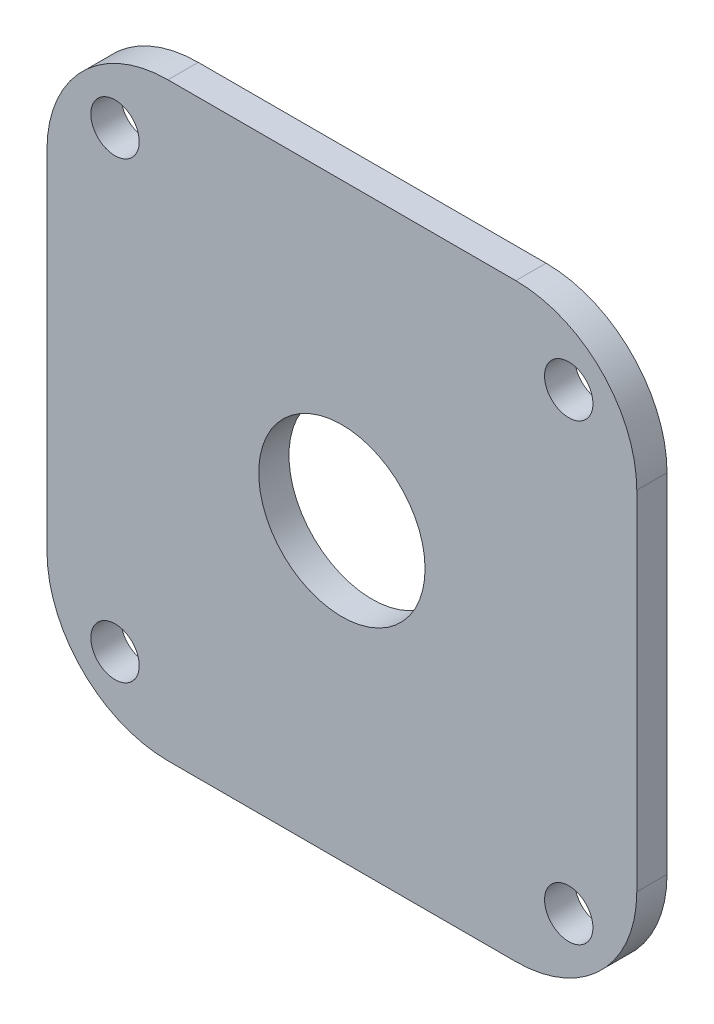
ISO-10303-21;
HEADER;
FILE_DESCRIPTION(('STEP AP214'),'2;1');
FILE_NAME('part.step','',(''),(''),'','','');
FILE_SCHEMA(('AUTOMOTIVE_DESIGN { 1 0 10303 214 1 1 1 1 }'));
ENDSEC;
DATA;
#1=APPLICATION_CONTEXT('core data for automotive mechanical design processes');
#2=APPLICATION_PROTOCOL_DEFINITION('international standard','automotive_design',2000,#1);
#3=PRODUCT_CONTEXT('',#1,'mechanical');
#4=PRODUCT('Part','Part','',(#3));
#5=PRODUCT_RELATED_PRODUCT_CATEGORY('part','',(#4));
#6=PRODUCT_DEFINITION_FORMATION('','',#4);
#7=PRODUCT_DEFINITION_CONTEXT('part definition',#1,'design');
#8=PRODUCT_DEFINITION('design','',#6,#7);
#9=PRODUCT_DEFINITION_SHAPE('','',#8);
#10=(LENGTH_UNIT() NAMED_UNIT(*) SI_UNIT(.MILLI.,.METRE.));
#11=(NAMED_UNIT(*) PLANE_ANGLE_UNIT() SI_UNIT($,.RADIAN.));
#12=(NAMED_UNIT(*) SI_UNIT($,.STERADIAN.) SOLID_ANGLE_UNIT());
#13=UNCERTAINTY_MEASURE_WITH_UNIT(LENGTH_MEASURE(1.E-05),#10,'distance_accuracy_value','');
#14=(GEOMETRIC_REPRESENTATION_CONTEXT(3) GLOBAL_UNCERTAINTY_ASSIGNED_CONTEXT((#13)) GLOBAL_UNIT_ASSIGNED_CONTEXT((#10,
#11,#12)) REPRESENTATION_CONTEXT('',''));
#15=CARTESIAN_POINT('',(0.,0.,0.));
#16=DIRECTION('',(0.,0.,1.));
#17=DIRECTION('',(1.,0.,0.));
#18=AXIS2_PLACEMENT_3D('',#15,#16,#17);
#19=CARTESIAN_POINT('',(11.5,-11.5,2.));
#20=DIRECTION('',(0.,0.,1.));
#21=DIRECTION('',(1.,0.,0.));
#22=AXIS2_PLACEMENT_3D('',#19,#20,#21);
#23=CYLINDRICAL_SURFACE('',#22,8.);
#24=DIRECTION('',(0.,0.,1.));
#25=VECTOR('',#24,1.);
#26=CARTESIAN_POINT('',(11.5,-19.5,2.));
#27=LINE('',#26,#25);
#28=CARTESIAN_POINT('',(11.5,-19.5,0.));
#29=VERTEX_POINT('',#28);
#30=CARTESIAN_POINT('',(11.5,-19.5,2.));
#31=VERTEX_POINT('',#30);
#32=EDGE_CURVE('E193',#29,#31,#27,.T.);
#33=ORIENTED_EDGE('',*,*,#32,.F.);
#34=CARTESIAN_POINT('',(11.5,-11.5,0.));
#35=DIRECTION('',(0.,0.,1.));
#36=DIRECTION('',(1.,0.,0.));
#37=AXIS2_PLACEMENT_3D('',#34,#35,#36);
#38=CIRCLE('',#37,8.);
#39=CARTESIAN_POINT('',(19.5,-11.5,0.));
#40=VERTEX_POINT('',#39);
#41=EDGE_CURVE('E55',#40,#29,#38,.F.);
#42=ORIENTED_EDGE('',*,*,#41,.F.);
#43=DIRECTION('',(0.,0.,1.));
#44=VECTOR('',#43,1.);
#45=CARTESIAN_POINT('',(19.5,-11.5,2.));
#46=LINE('',#45,#44);
#47=CARTESIAN_POINT('',(19.5,-11.5,2.));
#48=VERTEX_POINT('',#47);
#49=EDGE_CURVE('E197',#48,#40,#46,.F.);
#50=ORIENTED_EDGE('',*,*,#49,.F.);
#51=CARTESIAN_POINT('',(11.5,-11.5,2.));
#52=DIRECTION('',(0.,0.,1.));
#53=DIRECTION('',(1.,0.,0.));
#54=AXIS2_PLACEMENT_3D('',#51,#52,#53);
#55=CIRCLE('',#54,8.);
#56=EDGE_CURVE('E11',#31,#48,#55,.T.);
#57=ORIENTED_EDGE('',*,*,#56,.F.);
#58=EDGE_LOOP('',(#33,#42,#50,#57));
#59=FACE_BOUND('',#58,.T.);
#60=ADVANCED_FACE('F47',(#59),#23,.T.);
#61=CARTESIAN_POINT('',(-11.5,-11.5,2.));
#62=DIRECTION('',(0.,0.,1.));
#63=DIRECTION('',(1.,0.,0.));
#64=AXIS2_PLACEMENT_3D('',#61,#62,#63);
#65=CYLINDRICAL_SURFACE('',#64,8.);
#66=DIRECTION('',(0.,0.,-1.));
#67=VECTOR('',#66,1.);
#68=CARTESIAN_POINT('',(-11.5,-19.5,2.));
#69=LINE('',#68,#67);
#70=CARTESIAN_POINT('',(-11.5,-19.5,2.));
#71=VERTEX_POINT('',#70);
#72=CARTESIAN_POINT('',(-11.5,-19.5,0.));
#73=VERTEX_POINT('',#72);
#74=EDGE_CURVE('E179',#71,#73,#69,.T.);
#75=ORIENTED_EDGE('',*,*,#74,.F.);
#76=CARTESIAN_POINT('',(-11.5,-11.5,2.));
#77=DIRECTION('',(0.,0.,1.));
#78=DIRECTION('',(1.,0.,0.));
#79=AXIS2_PLACEMENT_3D('',#76,#77,#78);
#80=CIRCLE('',#79,8.);
#81=CARTESIAN_POINT('',(-19.5,-11.5,2.));
#82=VERTEX_POINT('',#81);
#83=EDGE_CURVE('E187',#82,#71,#80,.T.);
#84=ORIENTED_EDGE('',*,*,#83,.F.);
#85=DIRECTION('',(0.,0.,-1.));
#86=VECTOR('',#85,1.);
#87=CARTESIAN_POINT('',(-19.5,-11.5,2.));
#88=LINE('',#87,#86);
#89=CARTESIAN_POINT('',(-19.5,-11.5,0.));
#90=VERTEX_POINT('',#89);
#91=EDGE_CURVE('E183',#90,#82,#88,.F.);
#92=ORIENTED_EDGE('',*,*,#91,.F.);
#93=CARTESIAN_POINT('',(-11.5,-11.5,0.));
#94=DIRECTION('',(0.,0.,1.));
#95=DIRECTION('',(1.,0.,0.));
#96=AXIS2_PLACEMENT_3D('',#93,#94,#95);
#97=CIRCLE('',#96,8.);
#98=EDGE_CURVE('E190',#73,#90,#97,.F.);
#99=ORIENTED_EDGE('',*,*,#98,.F.);
#100=EDGE_LOOP('',(#75,#84,#92,#99));
#101=FACE_BOUND('',#100,.T.);
#102=ADVANCED_FACE('F207',(#101),#65,.T.);
#103=CARTESIAN_POINT('',(11.5,11.5,2.));
#104=DIRECTION('',(0.,0.,-1.));
#105=DIRECTION('',(-1.,0.,0.));
#106=AXIS2_PLACEMENT_3D('',#103,#104,#105);
#107=CYLINDRICAL_SURFACE('',#106,8.);
#108=DIRECTION('',(0.,0.,1.));
#109=VECTOR('',#108,1.);
#110=CARTESIAN_POINT('',(19.5,11.5,2.));
#111=LINE('',#110,#109);
#112=CARTESIAN_POINT('',(19.5,11.5,0.));
#113=VERTEX_POINT('',#112);
#114=CARTESIAN_POINT('',(19.5,11.5,2.));
#115=VERTEX_POINT('',#114);
#116=EDGE_CURVE('E167',#113,#115,#111,.T.);
#117=ORIENTED_EDGE('',*,*,#116,.F.);
#118=CARTESIAN_POINT('',(11.5,11.5,0.));
#119=DIRECTION('',(0.,0.,1.));
#120=DIRECTION('',(1.,0.,0.));
#121=AXIS2_PLACEMENT_3D('',#118,#119,#120);
#122=CIRCLE('',#121,8.);
#123=CARTESIAN_POINT('',(11.5,19.5,0.));
#124=VERTEX_POINT('',#123);
#125=EDGE_CURVE('E173',#124,#113,#122,.F.);
#126=ORIENTED_EDGE('',*,*,#125,.F.);
#127=DIRECTION('',(0.,0.,1.));
#128=VECTOR('',#127,1.);
#129=CARTESIAN_POINT('',(11.5,19.5,2.));
#130=LINE('',#129,#128);
#131=CARTESIAN_POINT('',(11.5,19.5,2.));
#132=VERTEX_POINT('',#131);
#133=EDGE_CURVE('E139',#132,#124,#130,.F.);
#134=ORIENTED_EDGE('',*,*,#133,.F.);
#135=CARTESIAN_POINT('',(11.5,11.5,2.));
#136=DIRECTION('',(0.,0.,1.));
#137=DIRECTION('',(1.,0.,0.));
#138=AXIS2_PLACEMENT_3D('',#135,#136,#137);
#139=CIRCLE('',#138,8.);
#140=EDGE_CURVE('E176',#115,#132,#139,.T.);
#141=ORIENTED_EDGE('',*,*,#140,.F.);
#142=EDGE_LOOP('',(#117,#126,#134,#141));
#143=FACE_BOUND('',#142,.T.);
#144=ADVANCED_FACE('F272',(#143),#107,.T.);
#145=CARTESIAN_POINT('',(-11.5,11.5,2.));
#146=DIRECTION('',(0.,0.,1.));
#147=DIRECTION('',(1.,0.,0.));
#148=AXIS2_PLACEMENT_3D('',#145,#146,#147);
#149=CYLINDRICAL_SURFACE('',#148,8.);
#150=DIRECTION('',(0.,0.,1.));
#151=VECTOR('',#150,1.);
#152=CARTESIAN_POINT('',(-11.5,19.5,2.));
#153=LINE('',#152,#151);
#154=CARTESIAN_POINT('',(-11.5,19.5,0.));
#155=VERTEX_POINT('',#154);
#156=CARTESIAN_POINT('',(-11.5,19.5,2.));
#157=VERTEX_POINT('',#156);
#158=EDGE_CURVE('E127',#155,#157,#153,.T.);
#159=ORIENTED_EDGE('',*,*,#158,.F.);
#160=CARTESIAN_POINT('',(-11.5,11.5,0.));
#161=DIRECTION('',(0.,0.,1.));
#162=DIRECTION('',(1.,0.,0.));
#163=AXIS2_PLACEMENT_3D('',#160,#161,#162);
#164=CIRCLE('',#163,8.);
#165=CARTESIAN_POINT('',(-19.5,11.5,0.));
#166=VERTEX_POINT('',#165);
#167=EDGE_CURVE('E109',#166,#155,#164,.F.);
#168=ORIENTED_EDGE('',*,*,#167,.F.);
#169=DIRECTION('',(0.,0.,1.));
#170=VECTOR('',#169,1.);
#171=CARTESIAN_POINT('',(-19.5,11.5,2.));
#172=LINE('',#171,#170);
#173=CARTESIAN_POINT('',(-19.5,11.5,2.));
#174=VERTEX_POINT('',#173);
#175=EDGE_CURVE('E124',#174,#166,#172,.F.);
#176=ORIENTED_EDGE('',*,*,#175,.F.);
#177=CARTESIAN_POINT('',(-11.5,11.5,2.));
#178=DIRECTION('',(0.,0.,1.));
#179=DIRECTION('',(1.,0.,0.));
#180=AXIS2_PLACEMENT_3D('',#177,#178,#179);
#181=CIRCLE('',#180,8.);
#182=EDGE_CURVE('E123',#157,#174,#181,.T.);
#183=ORIENTED_EDGE('',*,*,#182,.F.);
#184=EDGE_LOOP('',(#159,#168,#176,#183));
#185=FACE_BOUND('',#184,.T.);
#186=ADVANCED_FACE('F128',(#185),#149,.T.);
#187=CARTESIAN_POINT('',(0.,19.5,2.));
#188=DIRECTION('',(0.,1.,0.));
#189=DIRECTION('',(0.,0.,1.));
#190=AXIS2_PLACEMENT_3D('',#187,#188,#189);
#191=PLANE('',#190);
#192=DIRECTION('',(1.,0.,0.));
#193=VECTOR('',#192,1.);
#194=CARTESIAN_POINT('',(0.,19.5,2.));
#195=LINE('',#194,#193);
#196=EDGE_CURVE('E214',#157,#132,#195,.T.);
#197=ORIENTED_EDGE('',*,*,#196,.T.);
#198=ORIENTED_EDGE('',*,*,#133,.T.);
#199=DIRECTION('',(1.,0.,0.));
#200=VECTOR('',#199,1.);
#201=CARTESIAN_POINT('',(0.,19.5,0.));
#202=LINE('',#201,#200);
#203=EDGE_CURVE('E116',#155,#124,#202,.T.);
#204=ORIENTED_EDGE('',*,*,#203,.F.);
#205=ORIENTED_EDGE('',*,*,#158,.T.);
#206=EDGE_LOOP('',(#197,#198,#204,#205));
#207=FACE_BOUND('',#206,.T.);
#208=ADVANCED_FACE('F137',(#207),#191,.T.);
#209=CARTESIAN_POINT('',(-19.5,0.,2.));
#210=DIRECTION('',(-1.,0.,0.));
#211=DIRECTION('',(0.,0.,1.));
#212=AXIS2_PLACEMENT_3D('',#209,#210,#211);
#213=PLANE('',#212);
#214=DIRECTION('',(0.,1.,0.));
#215=VECTOR('',#214,1.);
#216=CARTESIAN_POINT('',(-19.5,0.,0.));
#217=LINE('',#216,#215);
#218=EDGE_CURVE('E118',#90,#166,#217,.T.);
#219=ORIENTED_EDGE('',*,*,#218,.F.);
#220=ORIENTED_EDGE('',*,*,#91,.T.);
#221=DIRECTION('',(0.,1.,0.));
#222=VECTOR('',#221,1.);
#223=CARTESIAN_POINT('',(-19.5,0.,2.));
#224=LINE('',#223,#222);
#225=EDGE_CURVE('E212',#82,#174,#224,.T.);
#226=ORIENTED_EDGE('',*,*,#225,.T.);
#227=ORIENTED_EDGE('',*,*,#175,.T.);
#228=EDGE_LOOP('',(#219,#220,#226,#227));
#229=FACE_BOUND('',#228,.T.);
#230=ADVANCED_FACE('F211',(#229),#213,.T.);
#231=CARTESIAN_POINT('',(0.,-19.5,2.));
#232=DIRECTION('',(0.,1.,0.));
#233=DIRECTION('',(0.,0.,1.));
#234=AXIS2_PLACEMENT_3D('',#231,#232,#233);
#235=PLANE('',#234);
#236=DIRECTION('',(1.,0.,0.));
#237=VECTOR('',#236,1.);
#238=CARTESIAN_POINT('',(0.,-19.5,0.));
#239=LINE('',#238,#237);
#240=EDGE_CURVE('E145',#73,#29,#239,.T.);
#241=ORIENTED_EDGE('',*,*,#240,.T.);
#242=ORIENTED_EDGE('',*,*,#32,.T.);
#243=DIRECTION('',(1.,0.,0.));
#244=VECTOR('',#243,1.);
#245=CARTESIAN_POINT('',(0.,-19.5,2.));
#246=LINE('',#245,#244);
#247=EDGE_CURVE('E205',#71,#31,#246,.T.);
#248=ORIENTED_EDGE('',*,*,#247,.F.);
#249=ORIENTED_EDGE('',*,*,#74,.T.);
#250=EDGE_LOOP('',(#241,#242,#248,#249));
#251=FACE_BOUND('',#250,.T.);
#252=ADVANCED_FACE('F203',(#251),#235,.F.);
#253=CARTESIAN_POINT('',(19.5,0.,2.));
#254=DIRECTION('',(-1.,0.,0.));
#255=DIRECTION('',(0.,0.,1.));
#256=AXIS2_PLACEMENT_3D('',#253,#254,#255);
#257=PLANE('',#256);
#258=DIRECTION('',(0.,1.,0.));
#259=VECTOR('',#258,1.);
#260=CARTESIAN_POINT('',(19.5,0.,2.));
#261=LINE('',#260,#259);
#262=EDGE_CURVE('E230',#48,#115,#261,.T.);
#263=ORIENTED_EDGE('',*,*,#262,.F.);
#264=ORIENTED_EDGE('',*,*,#49,.T.);
#265=DIRECTION('',(0.,1.,0.));
#266=VECTOR('',#265,1.);
#267=CARTESIAN_POINT('',(19.5,0.,0.));
#268=LINE('',#267,#266);
#269=EDGE_CURVE('E155',#40,#113,#268,.T.);
#270=ORIENTED_EDGE('',*,*,#269,.T.);
#271=ORIENTED_EDGE('',*,*,#116,.T.);
#272=EDGE_LOOP('',(#263,#264,#270,#271));
#273=FACE_BOUND('',#272,.T.);
#274=ADVANCED_FACE('F262',(#273),#257,.F.);
#275=CARTESIAN_POINT('',(15.,15.,2.));
#276=DIRECTION('',(0.,0.,-1.));
#277=DIRECTION('',(-1.,0.,0.));
#278=AXIS2_PLACEMENT_3D('',#275,#276,#277);
#279=CYLINDRICAL_SURFACE('',#278,1.6);
#280=CARTESIAN_POINT('',(15.,15.,2.));
#281=DIRECTION('',(0.,0.,1.));
#282=DIRECTION('',(1.,0.,0.));
#283=AXIS2_PLACEMENT_3D('',#280,#281,#282);
#284=CIRCLE('',#283,1.6);
#285=CARTESIAN_POINT('',(16.6,15.,2.));
#286=VERTEX_POINT('',#285);
#287=EDGE_CURVE('E220',#286,#286,#284,.T.);
#288=ORIENTED_EDGE('',*,*,#287,.T.);
#289=EDGE_LOOP('',(#288));
#290=FACE_BOUND('',#289,.T.);
#291=CARTESIAN_POINT('',(15.,15.,0.));
#292=DIRECTION('',(0.,0.,1.));
#293=DIRECTION('',(1.,0.,0.));
#294=AXIS2_PLACEMENT_3D('',#291,#292,#293);
#295=CIRCLE('',#294,1.6);
#296=CARTESIAN_POINT('',(16.6,15.,0.));
#297=VERTEX_POINT('',#296);
#298=EDGE_CURVE('E141',#297,#297,#295,.T.);
#299=ORIENTED_EDGE('',*,*,#298,.F.);
#300=EDGE_LOOP('',(#299));
#301=FACE_BOUND('',#300,.T.);
#302=ADVANCED_FACE('F252',(#290,#301),#279,.F.);
#303=CARTESIAN_POINT('',(14.9999999999999,-15.0000000000001,2.));
#304=DIRECTION('',(0.,0.,-1.));
#305=DIRECTION('',(-1.,0.,0.));
#306=AXIS2_PLACEMENT_3D('',#303,#304,#305);
#307=CYLINDRICAL_SURFACE('',#306,1.6);
#308=CARTESIAN_POINT('',(14.9999999999999,-15.0000000000001,2.));
#309=DIRECTION('',(0.,0.,1.));
#310=DIRECTION('',(1.,0.,0.));
#311=AXIS2_PLACEMENT_3D('',#308,#309,#310);
#312=CIRCLE('',#311,1.6);
#313=CARTESIAN_POINT('',(16.5999999999999,-15.0000000000001,2.));
#314=VERTEX_POINT('',#313);
#315=EDGE_CURVE('E224',#314,#314,#312,.T.);
#316=ORIENTED_EDGE('',*,*,#315,.T.);
#317=EDGE_LOOP('',(#316));
#318=FACE_BOUND('',#317,.T.);
#319=CARTESIAN_POINT('',(14.9999999999999,-15.0000000000001,0.));
#320=DIRECTION('',(0.,0.,1.));
#321=DIRECTION('',(1.,0.,0.));
#322=AXIS2_PLACEMENT_3D('',#319,#320,#321);
#323=CIRCLE('',#322,1.6);
#324=CARTESIAN_POINT('',(16.5999999999999,-15.0000000000001,0.));
#325=VERTEX_POINT('',#324);
#326=EDGE_CURVE('E148',#325,#325,#323,.T.);
#327=ORIENTED_EDGE('',*,*,#326,.F.);
#328=EDGE_LOOP('',(#327));
#329=FACE_BOUND('',#328,.T.);
#330=ADVANCED_FACE('F249',(#318,#329),#307,.F.);
#331=CARTESIAN_POINT('',(-15.0000000000002,-14.9999999999998,2.));
#332=DIRECTION('',(0.,0.,-1.));
#333=DIRECTION('',(-1.,0.,0.));
#334=AXIS2_PLACEMENT_3D('',#331,#332,#333);
#335=CYLINDRICAL_SURFACE('',#334,1.6);
#336=CARTESIAN_POINT('',(-15.0000000000002,-14.9999999999998,2.));
#337=DIRECTION('',(0.,0.,1.));
#338=DIRECTION('',(1.,0.,0.));
#339=AXIS2_PLACEMENT_3D('',#336,#337,#338);
#340=CIRCLE('',#339,1.6);
#341=CARTESIAN_POINT('',(-13.4000000000002,-14.9999999999998,2.));
#342=VERTEX_POINT('',#341);
#343=EDGE_CURVE('E403',#342,#342,#340,.T.);
#344=ORIENTED_EDGE('',*,*,#343,.T.);
#345=EDGE_LOOP('',(#344));
#346=FACE_BOUND('',#345,.T.);
#347=CARTESIAN_POINT('',(-15.0000000000002,-14.9999999999998,0.));
#348=DIRECTION('',(0.,0.,1.));
#349=DIRECTION('',(1.,0.,0.));
#350=AXIS2_PLACEMENT_3D('',#347,#348,#349);
#351=CIRCLE('',#350,1.6);
#352=CARTESIAN_POINT('',(-13.4000000000002,-14.9999999999998,0.));
#353=VERTEX_POINT('',#352);
#354=EDGE_CURVE('E240',#353,#353,#351,.T.);
#355=ORIENTED_EDGE('',*,*,#354,.F.);
#356=EDGE_LOOP('',(#355));
#357=FACE_BOUND('',#356,.T.);
#358=ADVANCED_FACE('F251',(#346,#357),#335,.F.);
#359=CARTESIAN_POINT('',(-15.,15.,2.));
#360=DIRECTION('',(0.,0.,-1.));
#361=DIRECTION('',(-1.,0.,0.));
#362=AXIS2_PLACEMENT_3D('',#359,#360,#361);
#363=CYLINDRICAL_SURFACE('',#362,1.6);
#364=CARTESIAN_POINT('',(-15.,15.,2.));
#365=DIRECTION('',(0.,0.,1.));
#366=DIRECTION('',(1.,0.,0.));
#367=AXIS2_PLACEMENT_3D('',#364,#365,#366);
#368=CIRCLE('',#367,1.6);
#369=CARTESIAN_POINT('',(-13.4,15.,2.));
#370=VERTEX_POINT('',#369);
#371=EDGE_CURVE('E161',#370,#370,#368,.T.);
#372=ORIENTED_EDGE('',*,*,#371,.T.);
#373=EDGE_LOOP('',(#372));
#374=FACE_BOUND('',#373,.T.);
#375=CARTESIAN_POINT('',(-15.,15.,0.));
#376=DIRECTION('',(0.,0.,1.));
#377=DIRECTION('',(1.,0.,0.));
#378=AXIS2_PLACEMENT_3D('',#375,#376,#377);
#379=CIRCLE('',#378,1.6);
#380=CARTESIAN_POINT('',(-13.4,15.,0.));
#381=VERTEX_POINT('',#380);
#382=EDGE_CURVE('E236',#381,#381,#379,.T.);
#383=ORIENTED_EDGE('',*,*,#382,.F.);
#384=EDGE_LOOP('',(#383));
#385=FACE_BOUND('',#384,.T.);
#386=ADVANCED_FACE('F259',(#374,#385),#363,.F.);
#387=CARTESIAN_POINT('',(0.,0.,2.));
#388=DIRECTION('',(0.,0.,-1.));
#389=DIRECTION('',(-1.,0.,0.));
#390=AXIS2_PLACEMENT_3D('',#387,#388,#389);
#391=CYLINDRICAL_SURFACE('',#390,5.5);
#392=CARTESIAN_POINT('',(0.,0.,2.));
#393=DIRECTION('',(0.,0.,1.));
#394=DIRECTION('',(1.,0.,0.));
#395=AXIS2_PLACEMENT_3D('',#392,#393,#394);
#396=CIRCLE('',#395,5.5);
#397=CARTESIAN_POINT('',(5.5,0.,2.));
#398=VERTEX_POINT('',#397);
#399=EDGE_CURVE('E134',#398,#398,#396,.T.);
#400=ORIENTED_EDGE('',*,*,#399,.T.);
#401=EDGE_LOOP('',(#400));
#402=FACE_BOUND('',#401,.T.);
#403=CARTESIAN_POINT('',(0.,0.,0.));
#404=DIRECTION('',(0.,0.,1.));
#405=DIRECTION('',(1.,0.,0.));
#406=AXIS2_PLACEMENT_3D('',#403,#404,#405);
#407=CIRCLE('',#406,5.5);
#408=CARTESIAN_POINT('',(5.5,0.,0.));
#409=VERTEX_POINT('',#408);
#410=EDGE_CURVE('E158',#409,#409,#407,.T.);
#411=ORIENTED_EDGE('',*,*,#410,.F.);
#412=EDGE_LOOP('',(#411));
#413=FACE_BOUND('',#412,.T.);
#414=ADVANCED_FACE('F283',(#402,#413),#391,.F.);
#415=CARTESIAN_POINT('',(0.,0.,2.));
#416=DIRECTION('',(0.,0.,1.));
#417=DIRECTION('',(1.,0.,0.));
#418=AXIS2_PLACEMENT_3D('',#415,#416,#417);
#419=PLANE('',#418);
#420=ORIENTED_EDGE('',*,*,#371,.F.);
#421=EDGE_LOOP('',(#420));
#422=FACE_BOUND('',#421,.T.);
#423=ORIENTED_EDGE('',*,*,#343,.F.);
#424=EDGE_LOOP('',(#423));
#425=FACE_BOUND('',#424,.T.);
#426=ORIENTED_EDGE('',*,*,#315,.F.);
#427=EDGE_LOOP('',(#426));
#428=FACE_BOUND('',#427,.T.);
#429=ORIENTED_EDGE('',*,*,#287,.F.);
#430=EDGE_LOOP('',(#429));
#431=FACE_BOUND('',#430,.T.);
#432=ORIENTED_EDGE('',*,*,#247,.T.);
#433=ORIENTED_EDGE('',*,*,#56,.T.);
#434=ORIENTED_EDGE('',*,*,#262,.T.);
#435=ORIENTED_EDGE('',*,*,#140,.T.);
#436=ORIENTED_EDGE('',*,*,#196,.F.);
#437=ORIENTED_EDGE('',*,*,#182,.T.);
#438=ORIENTED_EDGE('',*,*,#225,.F.);
#439=ORIENTED_EDGE('',*,*,#83,.T.);
#440=EDGE_LOOP('',(#432,#433,#434,#435,#436,#437,#438,#439));
#441=FACE_BOUND('',#440,.T.);
#442=ORIENTED_EDGE('',*,*,#399,.F.);
#443=EDGE_LOOP('',(#442));
#444=FACE_BOUND('',#443,.T.);
#445=ADVANCED_FACE('F216',(#422,#425,#428,#431,#441,#444),#419,.T.);
#446=CARTESIAN_POINT('',(0.,0.,0.));
#447=DIRECTION('',(0.,0.,1.));
#448=DIRECTION('',(1.,0.,0.));
#449=AXIS2_PLACEMENT_3D('',#446,#447,#448);
#450=PLANE('',#449);
#451=ORIENTED_EDGE('',*,*,#382,.T.);
#452=EDGE_LOOP('',(#451));
#453=FACE_BOUND('',#452,.T.);
#454=ORIENTED_EDGE('',*,*,#354,.T.);
#455=EDGE_LOOP('',(#454));
#456=FACE_BOUND('',#455,.T.);
#457=ORIENTED_EDGE('',*,*,#326,.T.);
#458=EDGE_LOOP('',(#457));
#459=FACE_BOUND('',#458,.T.);
#460=ORIENTED_EDGE('',*,*,#298,.T.);
#461=EDGE_LOOP('',(#460));
#462=FACE_BOUND('',#461,.T.);
#463=ORIENTED_EDGE('',*,*,#269,.F.);
#464=ORIENTED_EDGE('',*,*,#41,.T.);
#465=ORIENTED_EDGE('',*,*,#240,.F.);
#466=ORIENTED_EDGE('',*,*,#98,.T.);
#467=ORIENTED_EDGE('',*,*,#218,.T.);
#468=ORIENTED_EDGE('',*,*,#167,.T.);
#469=ORIENTED_EDGE('',*,*,#203,.T.);
#470=ORIENTED_EDGE('',*,*,#125,.T.);
#471=EDGE_LOOP('',(#463,#464,#465,#466,#467,#468,#469,#470));
#472=FACE_BOUND('',#471,.T.);
#473=ORIENTED_EDGE('',*,*,#410,.T.);
#474=EDGE_LOOP('',(#473));
#475=FACE_BOUND('',#474,.T.);
#476=ADVANCED_FACE('F112',(#453,#456,#459,#462,#472,#475),#450,.F.);
#477=CLOSED_SHELL('',(#60,#102,#144,#186,#208,#230,#252,#274,#302,#330,#358,#386,#414,#445,#476));
#478=MANIFOLD_SOLID_BREP('B2',#477);
#479=ADVANCED_BREP_SHAPE_REPRESENTATION('',(#18,#478),#14);
#480=SHAPE_DEFINITION_REPRESENTATION(#9,#479);
ENDSEC;
END-ISO-10303-21;
